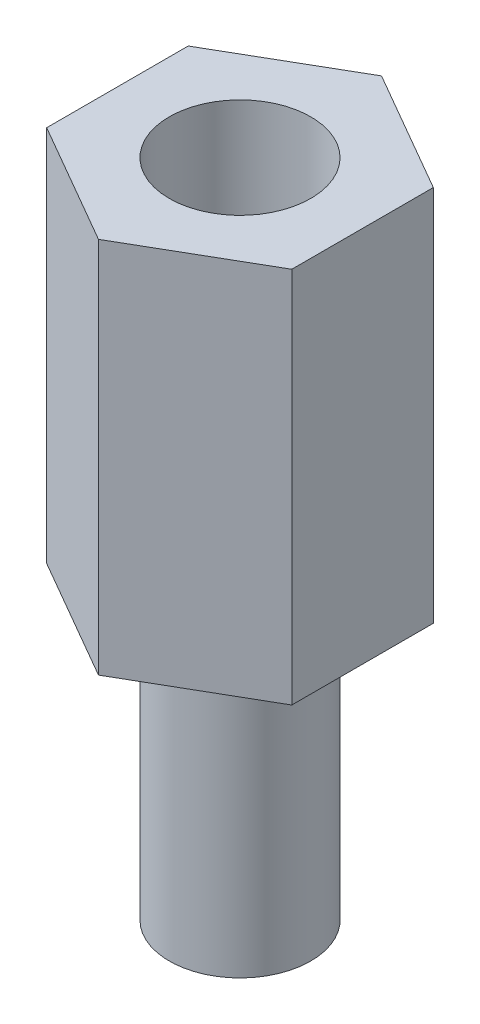
ISO-10303-21;
HEADER;
FILE_DESCRIPTION(('STEP AP214'),'2;1');
FILE_NAME('part.step','',(''),(''),'','','');
FILE_SCHEMA(('AUTOMOTIVE_DESIGN { 1 0 10303 214 1 1 1 1 }'));
ENDSEC;
DATA;
#1=APPLICATION_CONTEXT('core data for automotive mechanical design processes');
#2=APPLICATION_PROTOCOL_DEFINITION('international standard','automotive_design',2000,#1);
#3=PRODUCT_CONTEXT('',#1,'mechanical');
#4=PRODUCT('Part','Part','',(#3));
#5=PRODUCT_RELATED_PRODUCT_CATEGORY('part','',(#4));
#6=PRODUCT_DEFINITION_FORMATION('','',#4);
#7=PRODUCT_DEFINITION_CONTEXT('part definition',#1,'design');
#8=PRODUCT_DEFINITION('design','',#6,#7);
#9=PRODUCT_DEFINITION_SHAPE('','',#8);
#10=(LENGTH_UNIT() NAMED_UNIT(*) SI_UNIT(.MILLI.,.METRE.));
#11=(NAMED_UNIT(*) PLANE_ANGLE_UNIT() SI_UNIT($,.RADIAN.));
#12=(NAMED_UNIT(*) SI_UNIT($,.STERADIAN.) SOLID_ANGLE_UNIT());
#13=UNCERTAINTY_MEASURE_WITH_UNIT(LENGTH_MEASURE(1.E-05),#10,'distance_accuracy_value','');
#14=(GEOMETRIC_REPRESENTATION_CONTEXT(3) GLOBAL_UNCERTAINTY_ASSIGNED_CONTEXT((#13)) GLOBAL_UNIT_ASSIGNED_CONTEXT((#10,
#11,#12)) REPRESENTATION_CONTEXT('',''));
#15=CARTESIAN_POINT('',(0.,0.,0.));
#16=DIRECTION('',(0.,0.,1.));
#17=DIRECTION('',(1.,0.,0.));
#18=AXIS2_PLACEMENT_3D('',#15,#16,#17);
#19=CARTESIAN_POINT('',(-2.59807621135332,8.,-1.49999999999999));
#20=DIRECTION('',(1.,0.,0.));
#21=DIRECTION('',(0.,0.,-1.));
#22=AXIS2_PLACEMENT_3D('',#19,#20,#21);
#23=PLANE('',#22);
#24=DIRECTION('',(0.,0.,1.));
#25=VECTOR('',#24,1.);
#26=CARTESIAN_POINT('',(-2.59807621135332,0.,-1.49999999999999));
#27=LINE('',#26,#25);
#28=CARTESIAN_POINT('',(-2.59807621135332,0.,-1.49999999999999));
#29=VERTEX_POINT('',#28);
#30=CARTESIAN_POINT('',(-2.59807621135332,0.,1.49999999999999));
#31=VERTEX_POINT('',#30);
#32=EDGE_CURVE('E120',#29,#31,#27,.T.);
#33=ORIENTED_EDGE('',*,*,#32,.T.);
#34=DIRECTION('',(0.,-1.,0.));
#35=VECTOR('',#34,1.);
#36=CARTESIAN_POINT('',(-2.59807621135332,8.,1.49999999999999));
#37=LINE('',#36,#35);
#38=CARTESIAN_POINT('',(-2.59807621135332,8.,1.49999999999999));
#39=VERTEX_POINT('',#38);
#40=EDGE_CURVE('E37',#39,#31,#37,.T.);
#41=ORIENTED_EDGE('',*,*,#40,.F.);
#42=DIRECTION('',(0.,0.,1.));
#43=VECTOR('',#42,1.);
#44=CARTESIAN_POINT('',(-2.59807621135332,8.,-1.49999999999999));
#45=LINE('',#44,#43);
#46=CARTESIAN_POINT('',(-2.59807621135332,8.,-1.49999999999999));
#47=VERTEX_POINT('',#46);
#48=EDGE_CURVE('E131',#47,#39,#45,.T.);
#49=ORIENTED_EDGE('',*,*,#48,.F.);
#50=DIRECTION('',(0.,-1.,0.));
#51=VECTOR('',#50,1.);
#52=CARTESIAN_POINT('',(-2.59807621135332,8.,-1.49999999999999));
#53=LINE('',#52,#51);
#54=EDGE_CURVE('E116',#47,#29,#53,.T.);
#55=ORIENTED_EDGE('',*,*,#54,.T.);
#56=EDGE_LOOP('',(#33,#41,#49,#55));
#57=FACE_BOUND('',#56,.T.);
#58=ADVANCED_FACE('F34',(#57),#23,.F.);
#59=CARTESIAN_POINT('',(-2.59807621135332,8.,1.49999999999999));
#60=DIRECTION('',(0.500000000000001,0.,-0.866025403784438));
#61=DIRECTION('',(-0.866025403784438,0.,-0.500000000000001));
#62=AXIS2_PLACEMENT_3D('',#59,#60,#61);
#63=PLANE('',#62);
#64=DIRECTION('',(0.866025403784438,0.,0.500000000000001));
#65=VECTOR('',#64,1.);
#66=CARTESIAN_POINT('',(-2.59807621135332,0.,1.49999999999999));
#67=LINE('',#66,#65);
#68=CARTESIAN_POINT('',(0.,0.,3.));
#69=VERTEX_POINT('',#68);
#70=EDGE_CURVE('E123',#31,#69,#67,.T.);
#71=ORIENTED_EDGE('',*,*,#70,.T.);
#72=DIRECTION('',(0.,-1.,0.));
#73=VECTOR('',#72,1.);
#74=CARTESIAN_POINT('',(0.,8.,3.));
#75=LINE('',#74,#73);
#76=CARTESIAN_POINT('',(0.,8.,3.));
#77=VERTEX_POINT('',#76);
#78=EDGE_CURVE('E134',#77,#69,#75,.T.);
#79=ORIENTED_EDGE('',*,*,#78,.F.);
#80=DIRECTION('',(0.866025403784438,0.,0.500000000000001));
#81=VECTOR('',#80,1.);
#82=CARTESIAN_POINT('',(-2.59807621135332,8.,1.49999999999999));
#83=LINE('',#82,#81);
#84=EDGE_CURVE('E89',#39,#77,#83,.T.);
#85=ORIENTED_EDGE('',*,*,#84,.F.);
#86=ORIENTED_EDGE('',*,*,#40,.T.);
#87=EDGE_LOOP('',(#71,#79,#85,#86));
#88=FACE_BOUND('',#87,.T.);
#89=ADVANCED_FACE('F139',(#88),#63,.F.);
#90=CARTESIAN_POINT('',(0.,8.,3.));
#91=DIRECTION('',(-0.500000000000001,0.,-0.866025403784438));
#92=DIRECTION('',(-0.866025403784438,0.,0.500000000000001));
#93=AXIS2_PLACEMENT_3D('',#90,#91,#92);
#94=PLANE('',#93);
#95=DIRECTION('',(0.866025403784438,0.,-0.500000000000001));
#96=VECTOR('',#95,1.);
#97=CARTESIAN_POINT('',(0.,0.,3.));
#98=LINE('',#97,#96);
#99=CARTESIAN_POINT('',(2.59807621135332,0.,1.49999999999999));
#100=VERTEX_POINT('',#99);
#101=EDGE_CURVE('E126',#69,#100,#98,.T.);
#102=ORIENTED_EDGE('',*,*,#101,.T.);
#103=DIRECTION('',(0.,-1.,0.));
#104=VECTOR('',#103,1.);
#105=CARTESIAN_POINT('',(2.59807621135332,8.,1.49999999999999));
#106=LINE('',#105,#104);
#107=CARTESIAN_POINT('',(2.59807621135332,8.,1.49999999999999));
#108=VERTEX_POINT('',#107);
#109=EDGE_CURVE('E111',#108,#100,#106,.T.);
#110=ORIENTED_EDGE('',*,*,#109,.F.);
#111=DIRECTION('',(0.866025403784438,0.,-0.500000000000001));
#112=VECTOR('',#111,1.);
#113=CARTESIAN_POINT('',(0.,8.,3.));
#114=LINE('',#113,#112);
#115=EDGE_CURVE('E102',#77,#108,#114,.T.);
#116=ORIENTED_EDGE('',*,*,#115,.F.);
#117=ORIENTED_EDGE('',*,*,#78,.T.);
#118=EDGE_LOOP('',(#102,#110,#116,#117));
#119=FACE_BOUND('',#118,.T.);
#120=ADVANCED_FACE('F145',(#119),#94,.F.);
#121=CARTESIAN_POINT('',(2.59807621135332,8.,1.49999999999999));
#122=DIRECTION('',(-1.,0.,0.));
#123=DIRECTION('',(0.,0.,1.));
#124=AXIS2_PLACEMENT_3D('',#121,#122,#123);
#125=PLANE('',#124);
#126=DIRECTION('',(0.,0.,-1.));
#127=VECTOR('',#126,1.);
#128=CARTESIAN_POINT('',(2.59807621135332,0.,1.49999999999999));
#129=LINE('',#128,#127);
#130=CARTESIAN_POINT('',(2.59807621135332,0.,-1.49999999999999));
#131=VERTEX_POINT('',#130);
#132=EDGE_CURVE('E110',#100,#131,#129,.T.);
#133=ORIENTED_EDGE('',*,*,#132,.T.);
#134=DIRECTION('',(0.,-1.,0.));
#135=VECTOR('',#134,1.);
#136=CARTESIAN_POINT('',(2.59807621135332,8.,-1.49999999999999));
#137=LINE('',#136,#135);
#138=CARTESIAN_POINT('',(2.59807621135332,8.,-1.49999999999999));
#139=VERTEX_POINT('',#138);
#140=EDGE_CURVE('E107',#139,#131,#137,.T.);
#141=ORIENTED_EDGE('',*,*,#140,.F.);
#142=DIRECTION('',(0.,0.,-1.));
#143=VECTOR('',#142,1.);
#144=CARTESIAN_POINT('',(2.59807621135332,8.,1.49999999999999));
#145=LINE('',#144,#143);
#146=EDGE_CURVE('E96',#108,#139,#145,.T.);
#147=ORIENTED_EDGE('',*,*,#146,.F.);
#148=ORIENTED_EDGE('',*,*,#109,.T.);
#149=EDGE_LOOP('',(#133,#141,#147,#148));
#150=FACE_BOUND('',#149,.T.);
#151=ADVANCED_FACE('F108',(#150),#125,.F.);
#152=CARTESIAN_POINT('',(2.59807621135332,8.,-1.49999999999999));
#153=DIRECTION('',(-0.500000000000001,0.,0.866025403784438));
#154=DIRECTION('',(0.866025403784438,0.,0.500000000000001));
#155=AXIS2_PLACEMENT_3D('',#152,#153,#154);
#156=PLANE('',#155);
#157=DIRECTION('',(-0.866025403784438,0.,-0.500000000000001));
#158=VECTOR('',#157,1.);
#159=CARTESIAN_POINT('',(2.59807621135332,0.,-1.49999999999999));
#160=LINE('',#159,#158);
#161=CARTESIAN_POINT('',(0.,0.,-3.));
#162=VERTEX_POINT('',#161);
#163=EDGE_CURVE('E74',#131,#162,#160,.T.);
#164=ORIENTED_EDGE('',*,*,#163,.T.);
#165=DIRECTION('',(0.,-1.,0.));
#166=VECTOR('',#165,1.);
#167=CARTESIAN_POINT('',(0.,8.,-3.));
#168=LINE('',#167,#166);
#169=CARTESIAN_POINT('',(0.,8.,-3.));
#170=VERTEX_POINT('',#169);
#171=EDGE_CURVE('E112',#170,#162,#168,.T.);
#172=ORIENTED_EDGE('',*,*,#171,.F.);
#173=DIRECTION('',(-0.866025403784438,0.,-0.500000000000001));
#174=VECTOR('',#173,1.);
#175=CARTESIAN_POINT('',(2.59807621135332,8.,-1.49999999999999));
#176=LINE('',#175,#174);
#177=EDGE_CURVE('E100',#139,#170,#176,.T.);
#178=ORIENTED_EDGE('',*,*,#177,.F.);
#179=ORIENTED_EDGE('',*,*,#140,.T.);
#180=EDGE_LOOP('',(#164,#172,#178,#179));
#181=FACE_BOUND('',#180,.T.);
#182=ADVANCED_FACE('F114',(#181),#156,.F.);
#183=CARTESIAN_POINT('',(0.,8.,-3.));
#184=DIRECTION('',(0.500000000000001,0.,0.866025403784438));
#185=DIRECTION('',(0.866025403784438,0.,-0.500000000000001));
#186=AXIS2_PLACEMENT_3D('',#183,#184,#185);
#187=PLANE('',#186);
#188=DIRECTION('',(-0.866025403784438,0.,0.500000000000001));
#189=VECTOR('',#188,1.);
#190=CARTESIAN_POINT('',(0.,0.,-3.));
#191=LINE('',#190,#189);
#192=EDGE_CURVE('E80',#162,#29,#191,.T.);
#193=ORIENTED_EDGE('',*,*,#192,.T.);
#194=ORIENTED_EDGE('',*,*,#54,.F.);
#195=DIRECTION('',(-0.866025403784438,0.,0.500000000000001));
#196=VECTOR('',#195,1.);
#197=CARTESIAN_POINT('',(0.,8.,-3.));
#198=LINE('',#197,#196);
#199=EDGE_CURVE('E51',#170,#47,#198,.T.);
#200=ORIENTED_EDGE('',*,*,#199,.F.);
#201=ORIENTED_EDGE('',*,*,#171,.T.);
#202=EDGE_LOOP('',(#193,#194,#200,#201));
#203=FACE_BOUND('',#202,.T.);
#204=ADVANCED_FACE('F168',(#203),#187,.F.);
#205=CARTESIAN_POINT('',(0.,8.,0.));
#206=DIRECTION('',(0.,1.,0.));
#207=DIRECTION('',(0.,0.,1.));
#208=AXIS2_PLACEMENT_3D('',#205,#206,#207);
#209=PLANE('',#208);
#210=CARTESIAN_POINT('',(0.,8.,0.));
#211=DIRECTION('',(0.,1.,0.));
#212=DIRECTION('',(0.,0.,1.));
#213=AXIS2_PLACEMENT_3D('',#210,#211,#212);
#214=CIRCLE('',#213,1.5);
#215=CARTESIAN_POINT('',(0.,8.,1.5));
#216=VERTEX_POINT('',#215);
#217=EDGE_CURVE('E152',#216,#216,#214,.T.);
#218=ORIENTED_EDGE('',*,*,#217,.F.);
#219=EDGE_LOOP('',(#218));
#220=FACE_BOUND('',#219,.T.);
#221=ORIENTED_EDGE('',*,*,#48,.T.);
#222=ORIENTED_EDGE('',*,*,#84,.T.);
#223=ORIENTED_EDGE('',*,*,#115,.T.);
#224=ORIENTED_EDGE('',*,*,#146,.T.);
#225=ORIENTED_EDGE('',*,*,#177,.T.);
#226=ORIENTED_EDGE('',*,*,#199,.T.);
#227=EDGE_LOOP('',(#221,#222,#223,#224,#225,#226));
#228=FACE_BOUND('',#227,.T.);
#229=ADVANCED_FACE('F98',(#220,#228),#209,.T.);
#230=CARTESIAN_POINT('',(0.,0.,0.));
#231=DIRECTION('',(0.,1.,0.));
#232=DIRECTION('',(0.,0.,1.));
#233=AXIS2_PLACEMENT_3D('',#230,#231,#232);
#234=PLANE('',#233);
#235=CARTESIAN_POINT('',(0.,0.,0.));
#236=DIRECTION('',(0.,-1.,0.));
#237=DIRECTION('',(0.,0.,-1.));
#238=AXIS2_PLACEMENT_3D('',#235,#236,#237);
#239=CIRCLE('',#238,1.5);
#240=CARTESIAN_POINT('',(0.,0.,-1.5));
#241=VERTEX_POINT('',#240);
#242=EDGE_CURVE('E11',#241,#241,#239,.T.);
#243=ORIENTED_EDGE('',*,*,#242,.F.);
#244=EDGE_LOOP('',(#243));
#245=FACE_BOUND('',#244,.T.);
#246=ORIENTED_EDGE('',*,*,#32,.F.);
#247=ORIENTED_EDGE('',*,*,#192,.F.);
#248=ORIENTED_EDGE('',*,*,#163,.F.);
#249=ORIENTED_EDGE('',*,*,#132,.F.);
#250=ORIENTED_EDGE('',*,*,#101,.F.);
#251=ORIENTED_EDGE('',*,*,#70,.F.);
#252=EDGE_LOOP('',(#246,#247,#248,#249,#250,#251));
#253=FACE_BOUND('',#252,.T.);
#254=ADVANCED_FACE('F144',(#245,#253),#234,.F.);
#255=CARTESIAN_POINT('',(0.,-6.,0.));
#256=DIRECTION('',(0.,1.,0.));
#257=DIRECTION('',(0.,0.,1.));
#258=AXIS2_PLACEMENT_3D('',#255,#256,#257);
#259=CYLINDRICAL_SURFACE('',#258,1.5);
#260=CARTESIAN_POINT('',(0.,-6.,0.));
#261=DIRECTION('',(0.,-1.,0.));
#262=DIRECTION('',(0.,0.,-1.));
#263=AXIS2_PLACEMENT_3D('',#260,#261,#262);
#264=CIRCLE('',#263,1.5);
#265=CARTESIAN_POINT('',(0.,-6.,-1.5));
#266=VERTEX_POINT('',#265);
#267=EDGE_CURVE('E124',#266,#266,#264,.T.);
#268=ORIENTED_EDGE('',*,*,#267,.F.);
#269=EDGE_LOOP('',(#268));
#270=FACE_BOUND('',#269,.T.);
#271=ORIENTED_EDGE('',*,*,#242,.T.);
#272=EDGE_LOOP('',(#271));
#273=FACE_BOUND('',#272,.T.);
#274=ADVANCED_FACE('F174',(#270,#273),#259,.T.);
#275=CARTESIAN_POINT('',(0.,-6.,0.));
#276=DIRECTION('',(0.,-1.,0.));
#277=DIRECTION('',(0.,0.,-1.));
#278=AXIS2_PLACEMENT_3D('',#275,#276,#277);
#279=PLANE('',#278);
#280=ORIENTED_EDGE('',*,*,#267,.T.);
#281=EDGE_LOOP('',(#280));
#282=FACE_BOUND('',#281,.T.);
#283=ADVANCED_FACE('F163',(#282),#279,.T.);
#284=CARTESIAN_POINT('',(0.,2.,0.));
#285=DIRECTION('',(0.,1.,0.));
#286=DIRECTION('',(0.,0.,1.));
#287=AXIS2_PLACEMENT_3D('',#284,#285,#286);
#288=CYLINDRICAL_SURFACE('',#287,1.5);
#289=CARTESIAN_POINT('',(0.,2.,0.));
#290=DIRECTION('',(0.,1.,0.));
#291=DIRECTION('',(0.,0.,1.));
#292=AXIS2_PLACEMENT_3D('',#289,#290,#291);
#293=CIRCLE('',#292,1.5);
#294=CARTESIAN_POINT('',(0.,2.,1.5));
#295=VERTEX_POINT('',#294);
#296=EDGE_CURVE('E151',#295,#295,#293,.T.);
#297=ORIENTED_EDGE('',*,*,#296,.F.);
#298=EDGE_LOOP('',(#297));
#299=FACE_BOUND('',#298,.T.);
#300=ORIENTED_EDGE('',*,*,#217,.T.);
#301=EDGE_LOOP('',(#300));
#302=FACE_BOUND('',#301,.T.);
#303=ADVANCED_FACE('F160',(#299,#302),#288,.F.);
#304=CARTESIAN_POINT('',(0.,2.,0.));
#305=DIRECTION('',(0.,1.,0.));
#306=DIRECTION('',(0.,0.,1.));
#307=AXIS2_PLACEMENT_3D('',#304,#305,#306);
#308=PLANE('',#307);
#309=ORIENTED_EDGE('',*,*,#296,.T.);
#310=EDGE_LOOP('',(#309));
#311=FACE_BOUND('',#310,.T.);
#312=ADVANCED_FACE('F158',(#311),#308,.T.);
#313=CLOSED_SHELL('',(#58,#89,#120,#151,#182,#204,#229,#254,#274,#283,#303,#312));
#314=MANIFOLD_SOLID_BREP('B2',#313);
#315=ADVANCED_BREP_SHAPE_REPRESENTATION('',(#18,#314),#14);
#316=SHAPE_DEFINITION_REPRESENTATION(#9,#315);
ENDSEC;
END-ISO-10303-21;
